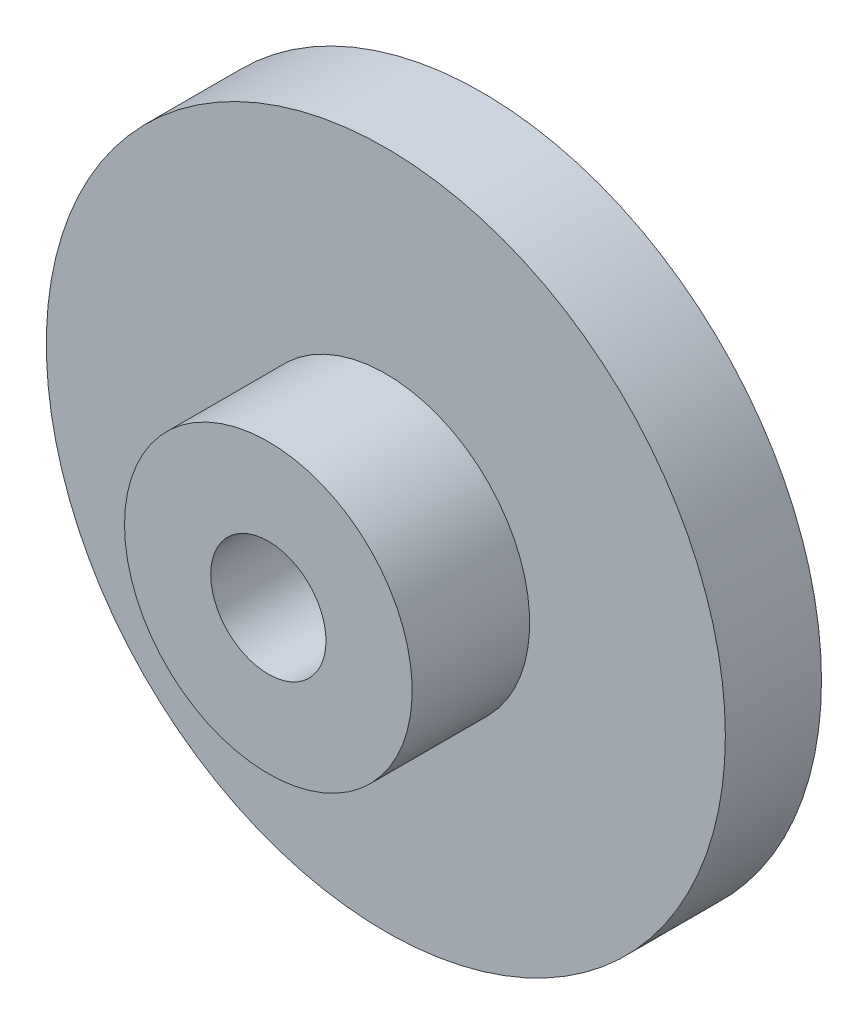
ISO-10303-21;
HEADER;
FILE_DESCRIPTION(('STEP AP214'),'2;1');
FILE_NAME('part.step','',(''),(''),'','','');
FILE_SCHEMA(('AUTOMOTIVE_DESIGN { 1 0 10303 214 1 1 1 1 }'));
ENDSEC;
DATA;
#1=APPLICATION_CONTEXT('core data for automotive mechanical design processes');
#2=APPLICATION_PROTOCOL_DEFINITION('international standard','automotive_design',2000,#1);
#3=PRODUCT_CONTEXT('',#1,'mechanical');
#4=PRODUCT('Part','Part','',(#3));
#5=PRODUCT_RELATED_PRODUCT_CATEGORY('part','',(#4));
#6=PRODUCT_DEFINITION_FORMATION('','',#4);
#7=PRODUCT_DEFINITION_CONTEXT('part definition',#1,'design');
#8=PRODUCT_DEFINITION('design','',#6,#7);
#9=PRODUCT_DEFINITION_SHAPE('','',#8);
#10=(LENGTH_UNIT() NAMED_UNIT(*) SI_UNIT(.MILLI.,.METRE.));
#11=(NAMED_UNIT(*) PLANE_ANGLE_UNIT() SI_UNIT($,.RADIAN.));
#12=(NAMED_UNIT(*) SI_UNIT($,.STERADIAN.) SOLID_ANGLE_UNIT());
#13=UNCERTAINTY_MEASURE_WITH_UNIT(LENGTH_MEASURE(1.E-05),#10,'distance_accuracy_value','');
#14=(GEOMETRIC_REPRESENTATION_CONTEXT(3) GLOBAL_UNCERTAINTY_ASSIGNED_CONTEXT((#13)) GLOBAL_UNIT_ASSIGNED_CONTEXT((#10,
#11,#12)) REPRESENTATION_CONTEXT('',''));
#15=CARTESIAN_POINT('',(0.,0.,0.));
#16=DIRECTION('',(0.,0.,1.));
#17=DIRECTION('',(1.,0.,0.));
#18=AXIS2_PLACEMENT_3D('',#15,#16,#17);
#19=CARTESIAN_POINT('',(0.,0.,14.));
#20=DIRECTION('',(0.,0.,-1.));
#21=DIRECTION('',(-1.,0.,0.));
#22=AXIS2_PLACEMENT_3D('',#19,#20,#21);
#23=CYLINDRICAL_SURFACE('',#22,3.775);
#24=CARTESIAN_POINT('',(0.,0.,14.));
#25=DIRECTION('',(0.,0.,1.));
#26=DIRECTION('',(1.,0.,0.));
#27=AXIS2_PLACEMENT_3D('',#24,#25,#26);
#28=CIRCLE('',#27,3.775);
#29=CARTESIAN_POINT('',(-3.775,0.,14.));
#30=VERTEX_POINT('',#29);
#31=EDGE_CURVE('E46',#30,#30,#28,.F.);
#32=CARTESIAN_POINT('',(0.,0.,6.3));
#33=DIRECTION('',(0.,0.,1.));
#34=DIRECTION('',(1.,0.,0.));
#35=AXIS2_PLACEMENT_3D('',#32,#33,#34);
#36=CIRCLE('',#35,3.775);
#37=CARTESIAN_POINT('',(-3.775,0.,6.3));
#38=VERTEX_POINT('',#37);
#39=EDGE_CURVE('E52',#38,#38,#36,.F.);
#40=CARTESIAN_POINT('',(-3.775,0.,14.));
#41=CARTESIAN_POINT('',(-3.775,0.,13.9197916666667));
#42=CARTESIAN_POINT('',(-3.775,0.,13.8395833333333));
#43=CARTESIAN_POINT('',(-3.775,0.,13.6791666666667));
#44=CARTESIAN_POINT('',(-3.775,0.,13.5989583333333));
#45=CARTESIAN_POINT('',(-3.775,0.,13.4385416666667));
#46=CARTESIAN_POINT('',(-3.775,0.,13.3583333333333));
#47=CARTESIAN_POINT('',(-3.775,0.,13.1979166666667));
#48=CARTESIAN_POINT('',(-3.775,0.,13.1177083333333));
#49=CARTESIAN_POINT('',(-3.775,0.,12.9572916666667));
#50=CARTESIAN_POINT('',(-3.775,0.,12.8770833333333));
#51=CARTESIAN_POINT('',(-3.775,0.,12.7166666666667));
#52=CARTESIAN_POINT('',(-3.775,0.,12.6364583333333));
#53=CARTESIAN_POINT('',(-3.775,0.,12.4760416666667));
#54=CARTESIAN_POINT('',(-3.775,0.,12.3958333333333));
#55=CARTESIAN_POINT('',(-3.775,0.,12.2354166666667));
#56=CARTESIAN_POINT('',(-3.775,0.,12.1552083333333));
#57=CARTESIAN_POINT('',(-3.775,0.,11.9947916666667));
#58=CARTESIAN_POINT('',(-3.775,0.,11.9145833333333));
#59=CARTESIAN_POINT('',(-3.775,0.,11.7541666666667));
#60=CARTESIAN_POINT('',(-3.775,0.,11.6739583333333));
#61=CARTESIAN_POINT('',(-3.775,0.,11.5135416666667));
#62=CARTESIAN_POINT('',(-3.775,0.,11.4333333333333));
#63=CARTESIAN_POINT('',(-3.775,0.,11.2729166666667));
#64=CARTESIAN_POINT('',(-3.775,0.,11.1927083333333));
#65=CARTESIAN_POINT('',(-3.775,0.,11.0322916666667));
#66=CARTESIAN_POINT('',(-3.775,0.,10.9520833333333));
#67=CARTESIAN_POINT('',(-3.775,0.,10.7916666666667));
#68=CARTESIAN_POINT('',(-3.775,0.,10.7114583333333));
#69=CARTESIAN_POINT('',(-3.775,0.,10.5510416666667));
#70=CARTESIAN_POINT('',(-3.775,0.,10.4708333333333));
#71=CARTESIAN_POINT('',(-3.775,0.,10.3104166666667));
#72=CARTESIAN_POINT('',(-3.775,0.,10.2302083333333));
#73=CARTESIAN_POINT('',(-3.775,0.,10.0697916666667));
#74=CARTESIAN_POINT('',(-3.775,0.,9.98958333333333));
#75=CARTESIAN_POINT('',(-3.775,0.,9.82916666666667));
#76=CARTESIAN_POINT('',(-3.775,0.,9.74895833333333));
#77=CARTESIAN_POINT('',(-3.775,0.,9.58854166666667));
#78=CARTESIAN_POINT('',(-3.775,0.,9.50833333333333));
#79=CARTESIAN_POINT('',(-3.775,0.,9.34791666666667));
#80=CARTESIAN_POINT('',(-3.775,0.,9.26770833333333));
#81=CARTESIAN_POINT('',(-3.775,0.,9.10729166666667));
#82=CARTESIAN_POINT('',(-3.775,0.,9.02708333333333));
#83=CARTESIAN_POINT('',(-3.775,0.,8.86666666666667));
#84=CARTESIAN_POINT('',(-3.775,0.,8.78645833333333));
#85=CARTESIAN_POINT('',(-3.775,0.,8.62604166666667));
#86=CARTESIAN_POINT('',(-3.775,0.,8.54583333333333));
#87=CARTESIAN_POINT('',(-3.775,0.,8.38541666666667));
#88=CARTESIAN_POINT('',(-3.775,0.,8.30520833333333));
#89=CARTESIAN_POINT('',(-3.775,0.,8.14479166666667));
#90=CARTESIAN_POINT('',(-3.775,0.,8.06458333333333));
#91=CARTESIAN_POINT('',(-3.775,0.,7.90416666666667));
#92=CARTESIAN_POINT('',(-3.775,0.,7.82395833333333));
#93=CARTESIAN_POINT('',(-3.775,0.,7.66354166666667));
#94=CARTESIAN_POINT('',(-3.775,0.,7.58333333333333));
#95=CARTESIAN_POINT('',(-3.775,0.,7.42291666666667));
#96=CARTESIAN_POINT('',(-3.775,0.,7.34270833333333));
#97=CARTESIAN_POINT('',(-3.775,0.,7.18229166666667));
#98=CARTESIAN_POINT('',(-3.775,0.,7.10208333333333));
#99=CARTESIAN_POINT('',(-3.775,0.,6.94166666666667));
#100=CARTESIAN_POINT('',(-3.775,0.,6.86145833333333));
#101=CARTESIAN_POINT('',(-3.775,0.,6.70104166666667));
#102=CARTESIAN_POINT('',(-3.775,0.,6.62083333333333));
#103=CARTESIAN_POINT('',(-3.775,0.,6.46041666666667));
#104=CARTESIAN_POINT('',(-3.775,0.,6.38020833333333));
#105=CARTESIAN_POINT('',(-3.775,0.,6.3));
#106=B_SPLINE_CURVE_WITH_KNOTS('',3,(#40,#41,#42,#43,#44,#45,#46,#47,#48,#49,#50,#51,#52,#53,
#54,#55,#56,#57,#58,#59,#60,#61,#62,#63,#64,#65,#66,#67,#68,#69,#70,#71,#72,#73,#74,#75,#76,#77,
#78,#79,#80,#81,#82,#83,#84,#85,#86,#87,#88,#89,#90,#91,#92,#93,#94,#95,#96,#97,#98,#99,#100,
#101,#102,#103,#104,#105),.UNSPECIFIED.,.F.,.F.,(4,2,2,2,2,2,2,2,2,2,2,2,2,2,2,2,2,2,2,2,2,2,2,
2,2,2,2,2,2,2,2,2,4),(0.,0.240625,0.481249999999999,0.721874999999999,0.9625,1.203125,1.44375,
1.684375,1.925,2.165625,2.40625,2.646875,2.8875,3.128125,3.36875,3.609375,3.85,4.090625,4.33125,
4.571875,4.8125,5.053125,5.29375,5.534375,5.775,6.015625,6.25625,6.496875,6.7375,6.978125,
7.21875,7.459375,7.7),.UNSPECIFIED.);
#107=EDGE_CURVE('BSEAM39',#30,#38,#106,.T.);
#108=ORIENTED_EDGE('',*,*,#31,.F.);
#109=ORIENTED_EDGE('',*,*,#39,.T.);
#110=ORIENTED_EDGE('',*,*,#107,.T.);
#111=ORIENTED_EDGE('',*,*,#107,.F.);
#112=EDGE_LOOP('',(#108,#110,#109,#111));
#113=FACE_BOUND('',#112,.T.);
#114=ADVANCED_FACE('F39',(#113),#23,.F.);
#115=CARTESIAN_POINT('',(0.,0.,14.));
#116=DIRECTION('',(0.,0.,-1.));
#117=DIRECTION('',(-1.,0.,0.));
#118=AXIS2_PLACEMENT_3D('',#115,#116,#117);
#119=CYLINDRICAL_SURFACE('',#118,9.425);
#120=CARTESIAN_POINT('',(0.,0.,14.));
#121=DIRECTION('',(0.,0.,1.));
#122=DIRECTION('',(1.,0.,0.));
#123=AXIS2_PLACEMENT_3D('',#120,#121,#122);
#124=CIRCLE('',#123,9.425);
#125=CARTESIAN_POINT('',(-9.425,0.,14.));
#126=VERTEX_POINT('',#125);
#127=EDGE_CURVE('E11',#126,#126,#124,.T.);
#128=CARTESIAN_POINT('',(0.,0.,6.3));
#129=DIRECTION('',(0.,0.,1.));
#130=DIRECTION('',(1.,0.,0.));
#131=AXIS2_PLACEMENT_3D('',#128,#129,#130);
#132=CIRCLE('',#131,9.425);
#133=CARTESIAN_POINT('',(-9.425,0.,6.3));
#134=VERTEX_POINT('',#133);
#135=EDGE_CURVE('E42',#134,#134,#132,.T.);
#136=CARTESIAN_POINT('',(-9.425,0.,14.));
#137=CARTESIAN_POINT('',(-9.425,0.,13.9197916666667));
#138=CARTESIAN_POINT('',(-9.425,0.,13.8395833333333));
#139=CARTESIAN_POINT('',(-9.425,0.,13.6791666666667));
#140=CARTESIAN_POINT('',(-9.425,0.,13.5989583333333));
#141=CARTESIAN_POINT('',(-9.425,0.,13.4385416666667));
#142=CARTESIAN_POINT('',(-9.425,0.,13.3583333333333));
#143=CARTESIAN_POINT('',(-9.425,0.,13.1979166666667));
#144=CARTESIAN_POINT('',(-9.425,0.,13.1177083333333));
#145=CARTESIAN_POINT('',(-9.425,0.,12.9572916666667));
#146=CARTESIAN_POINT('',(-9.425,0.,12.8770833333333));
#147=CARTESIAN_POINT('',(-9.425,0.,12.7166666666667));
#148=CARTESIAN_POINT('',(-9.425,0.,12.6364583333333));
#149=CARTESIAN_POINT('',(-9.425,0.,12.4760416666667));
#150=CARTESIAN_POINT('',(-9.425,0.,12.3958333333333));
#151=CARTESIAN_POINT('',(-9.425,0.,12.2354166666667));
#152=CARTESIAN_POINT('',(-9.425,0.,12.1552083333333));
#153=CARTESIAN_POINT('',(-9.425,0.,11.9947916666667));
#154=CARTESIAN_POINT('',(-9.425,0.,11.9145833333333));
#155=CARTESIAN_POINT('',(-9.425,0.,11.7541666666667));
#156=CARTESIAN_POINT('',(-9.425,0.,11.6739583333333));
#157=CARTESIAN_POINT('',(-9.425,0.,11.5135416666667));
#158=CARTESIAN_POINT('',(-9.425,0.,11.4333333333333));
#159=CARTESIAN_POINT('',(-9.425,0.,11.2729166666667));
#160=CARTESIAN_POINT('',(-9.425,0.,11.1927083333333));
#161=CARTESIAN_POINT('',(-9.425,0.,11.0322916666667));
#162=CARTESIAN_POINT('',(-9.425,0.,10.9520833333333));
#163=CARTESIAN_POINT('',(-9.425,0.,10.7916666666667));
#164=CARTESIAN_POINT('',(-9.425,0.,10.7114583333333));
#165=CARTESIAN_POINT('',(-9.425,0.,10.5510416666667));
#166=CARTESIAN_POINT('',(-9.425,0.,10.4708333333333));
#167=CARTESIAN_POINT('',(-9.425,0.,10.3104166666667));
#168=CARTESIAN_POINT('',(-9.425,0.,10.2302083333333));
#169=CARTESIAN_POINT('',(-9.425,0.,10.0697916666667));
#170=CARTESIAN_POINT('',(-9.425,0.,9.98958333333333));
#171=CARTESIAN_POINT('',(-9.425,0.,9.82916666666667));
#172=CARTESIAN_POINT('',(-9.425,0.,9.74895833333333));
#173=CARTESIAN_POINT('',(-9.425,0.,9.58854166666667));
#174=CARTESIAN_POINT('',(-9.425,0.,9.50833333333333));
#175=CARTESIAN_POINT('',(-9.425,0.,9.34791666666667));
#176=CARTESIAN_POINT('',(-9.425,0.,9.26770833333333));
#177=CARTESIAN_POINT('',(-9.425,0.,9.10729166666667));
#178=CARTESIAN_POINT('',(-9.425,0.,9.02708333333333));
#179=CARTESIAN_POINT('',(-9.425,0.,8.86666666666667));
#180=CARTESIAN_POINT('',(-9.425,0.,8.78645833333333));
#181=CARTESIAN_POINT('',(-9.425,0.,8.62604166666667));
#182=CARTESIAN_POINT('',(-9.425,0.,8.54583333333333));
#183=CARTESIAN_POINT('',(-9.425,0.,8.38541666666667));
#184=CARTESIAN_POINT('',(-9.425,0.,8.30520833333333));
#185=CARTESIAN_POINT('',(-9.425,0.,8.14479166666667));
#186=CARTESIAN_POINT('',(-9.425,0.,8.06458333333333));
#187=CARTESIAN_POINT('',(-9.425,0.,7.90416666666667));
#188=CARTESIAN_POINT('',(-9.425,0.,7.82395833333333));
#189=CARTESIAN_POINT('',(-9.425,0.,7.66354166666667));
#190=CARTESIAN_POINT('',(-9.425,0.,7.58333333333333));
#191=CARTESIAN_POINT('',(-9.425,0.,7.42291666666667));
#192=CARTESIAN_POINT('',(-9.425,0.,7.34270833333333));
#193=CARTESIAN_POINT('',(-9.425,0.,7.18229166666667));
#194=CARTESIAN_POINT('',(-9.425,0.,7.10208333333333));
#195=CARTESIAN_POINT('',(-9.425,0.,6.94166666666667));
#196=CARTESIAN_POINT('',(-9.425,0.,6.86145833333333));
#197=CARTESIAN_POINT('',(-9.425,0.,6.70104166666667));
#198=CARTESIAN_POINT('',(-9.425,0.,6.62083333333333));
#199=CARTESIAN_POINT('',(-9.425,0.,6.46041666666667));
#200=CARTESIAN_POINT('',(-9.425,0.,6.38020833333333));
#201=CARTESIAN_POINT('',(-9.425,0.,6.3));
#202=B_SPLINE_CURVE_WITH_KNOTS('',3,(#136,#137,#138,#139,#140,#141,#142,#143,#144,#145,#146,
#147,#148,#149,#150,#151,#152,#153,#154,#155,#156,#157,#158,#159,#160,#161,#162,#163,#164,#165,
#166,#167,#168,#169,#170,#171,#172,#173,#174,#175,#176,#177,#178,#179,#180,#181,#182,#183,#184,
#185,#186,#187,#188,#189,#190,#191,#192,#193,#194,#195,#196,#197,#198,#199,#200,#201),
.UNSPECIFIED.,.F.,.F.,(4,2,2,2,2,2,2,2,2,2,2,2,2,2,2,2,2,2,2,2,2,2,2,2,2,2,2,2,2,2,2,2,4),(0.,
0.240625000000001,0.481250000000001,0.721875,0.962500000000002,1.203125,1.44375,1.684375,1.925,
2.165625,2.40625,2.646875,2.8875,3.128125,3.36875,3.609375,3.85,4.090625,4.33125,4.571875,
4.8125,5.053125,5.29375,5.534375,5.775,6.015625,6.25625,6.496875,6.7375,6.978125,7.21875,
7.459375,7.7),.UNSPECIFIED.);
#203=EDGE_CURVE('BSEAM59',#126,#134,#202,.T.);
#204=ORIENTED_EDGE('',*,*,#127,.F.);
#205=ORIENTED_EDGE('',*,*,#135,.T.);
#206=ORIENTED_EDGE('',*,*,#203,.T.);
#207=ORIENTED_EDGE('',*,*,#203,.F.);
#208=EDGE_LOOP('',(#204,#206,#205,#207));
#209=FACE_BOUND('',#208,.T.);
#210=ADVANCED_FACE('F59',(#209),#119,.T.);
#211=CARTESIAN_POINT('',(0.,0.,14.));
#212=DIRECTION('',(0.,0.,1.));
#213=DIRECTION('',(1.,0.,0.));
#214=AXIS2_PLACEMENT_3D('',#211,#212,#213);
#215=PLANE('',#214);
#216=ORIENTED_EDGE('',*,*,#31,.T.);
#217=EDGE_LOOP('',(#216));
#218=FACE_BOUND('',#217,.T.);
#219=ORIENTED_EDGE('',*,*,#127,.T.);
#220=EDGE_LOOP('',(#219));
#221=FACE_BOUND('',#220,.T.);
#222=ADVANCED_FACE('F63',(#218,#221),#215,.T.);
#223=CARTESIAN_POINT('',(0.,0.,6.3));
#224=DIRECTION('',(0.,0.,1.));
#225=DIRECTION('',(1.,0.,0.));
#226=AXIS2_PLACEMENT_3D('',#223,#224,#225);
#227=PLANE('',#226);
#228=ORIENTED_EDGE('',*,*,#39,.F.);
#229=EDGE_LOOP('',(#228));
#230=FACE_BOUND('',#229,.T.);
#231=ORIENTED_EDGE('',*,*,#135,.F.);
#232=EDGE_LOOP('',(#231));
#233=FACE_BOUND('',#232,.T.);
#234=ADVANCED_FACE('F61',(#230,#233),#227,.F.);
#235=CLOSED_SHELL('',(#114,#210,#222,#234));
#236=MANIFOLD_SOLID_BREP('B2',#235);
#237=CARTESIAN_POINT('',(0.,0.,6.3));
#238=DIRECTION('',(0.,0.,1.));
#239=DIRECTION('',(1.,0.,0.));
#240=AXIS2_PLACEMENT_3D('',#237,#238,#239);
#241=PLANE('',#240);
#242=CARTESIAN_POINT('',(0.,0.,6.3));
#243=DIRECTION('',(0.,0.,1.));
#244=DIRECTION('',(1.,0.,0.));
#245=AXIS2_PLACEMENT_3D('',#242,#243,#244);
#246=CIRCLE('',#245,22.25);
#247=CARTESIAN_POINT('',(22.25,0.,6.3));
#248=VERTEX_POINT('',#247);
#249=EDGE_CURVE('E38',#248,#248,#246,.T.);
#250=ORIENTED_EDGE('',*,*,#249,.T.);
#251=EDGE_LOOP('',(#250));
#252=FACE_BOUND('',#251,.T.);
#253=CARTESIAN_POINT('',(0.,0.,6.3));
#254=DIRECTION('',(0.,0.,1.));
#255=DIRECTION('',(1.,0.,0.));
#256=AXIS2_PLACEMENT_3D('',#253,#254,#255);
#257=CIRCLE('',#256,3.775);
#258=CARTESIAN_POINT('',(3.775,0.,6.3));
#259=VERTEX_POINT('',#258);
#260=EDGE_CURVE('E112',#259,#259,#257,.T.);
#261=ORIENTED_EDGE('',*,*,#260,.F.);
#262=EDGE_LOOP('',(#261));
#263=FACE_BOUND('',#262,.T.);
#264=ADVANCED_FACE('F101',(#252,#263),#241,.T.);
#265=CARTESIAN_POINT('',(0.,0.,0.));
#266=DIRECTION('',(0.,0.,1.));
#267=DIRECTION('',(1.,0.,0.));
#268=AXIS2_PLACEMENT_3D('',#265,#266,#267);
#269=PLANE('',#268);
#270=CARTESIAN_POINT('',(0.,0.,0.));
#271=DIRECTION('',(0.,0.,1.));
#272=DIRECTION('',(1.,0.,0.));
#273=AXIS2_PLACEMENT_3D('',#270,#271,#272);
#274=CIRCLE('',#273,22.25);
#275=CARTESIAN_POINT('',(22.25,0.,0.));
#276=VERTEX_POINT('',#275);
#277=EDGE_CURVE('E105',#276,#276,#274,.T.);
#278=ORIENTED_EDGE('',*,*,#277,.F.);
#279=EDGE_LOOP('',(#278));
#280=FACE_BOUND('',#279,.T.);
#281=CARTESIAN_POINT('',(0.,0.,0.));
#282=DIRECTION('',(0.,0.,1.));
#283=DIRECTION('',(1.,0.,0.));
#284=AXIS2_PLACEMENT_3D('',#281,#282,#283);
#285=CIRCLE('',#284,3.775);
#286=CARTESIAN_POINT('',(3.775,0.,0.));
#287=VERTEX_POINT('',#286);
#288=EDGE_CURVE('E114',#287,#287,#285,.T.);
#289=ORIENTED_EDGE('',*,*,#288,.T.);
#290=EDGE_LOOP('',(#289));
#291=FACE_BOUND('',#290,.T.);
#292=ADVANCED_FACE('F124',(#280,#291),#269,.F.);
#293=CARTESIAN_POINT('',(0.,0.,6.3));
#294=DIRECTION('',(0.,0.,-1.));
#295=DIRECTION('',(-1.,0.,0.));
#296=AXIS2_PLACEMENT_3D('',#293,#294,#295);
#297=CYLINDRICAL_SURFACE('',#296,22.25);
#298=ORIENTED_EDGE('',*,*,#249,.F.);
#299=EDGE_LOOP('',(#298));
#300=FACE_BOUND('',#299,.T.);
#301=ORIENTED_EDGE('',*,*,#277,.T.);
#302=EDGE_LOOP('',(#301));
#303=FACE_BOUND('',#302,.T.);
#304=ADVANCED_FACE('F103',(#300,#303),#297,.T.);
#305=CARTESIAN_POINT('',(0.,0.,6.3));
#306=DIRECTION('',(0.,0.,-1.));
#307=DIRECTION('',(-1.,0.,0.));
#308=AXIS2_PLACEMENT_3D('',#305,#306,#307);
#309=CYLINDRICAL_SURFACE('',#308,3.775);
#310=ORIENTED_EDGE('',*,*,#260,.T.);
#311=EDGE_LOOP('',(#310));
#312=FACE_BOUND('',#311,.T.);
#313=ORIENTED_EDGE('',*,*,#288,.F.);
#314=EDGE_LOOP('',(#313));
#315=FACE_BOUND('',#314,.T.);
#316=ADVANCED_FACE('F120',(#312,#315),#309,.F.);
#317=CLOSED_SHELL('',(#264,#292,#304,#316));
#318=MANIFOLD_SOLID_BREP('B6',#317);
#319=ADVANCED_BREP_SHAPE_REPRESENTATION('',(#18,#236,#318),#14);
#320=SHAPE_DEFINITION_REPRESENTATION(#9,#319);
ENDSEC;
END-ISO-10303-21;
